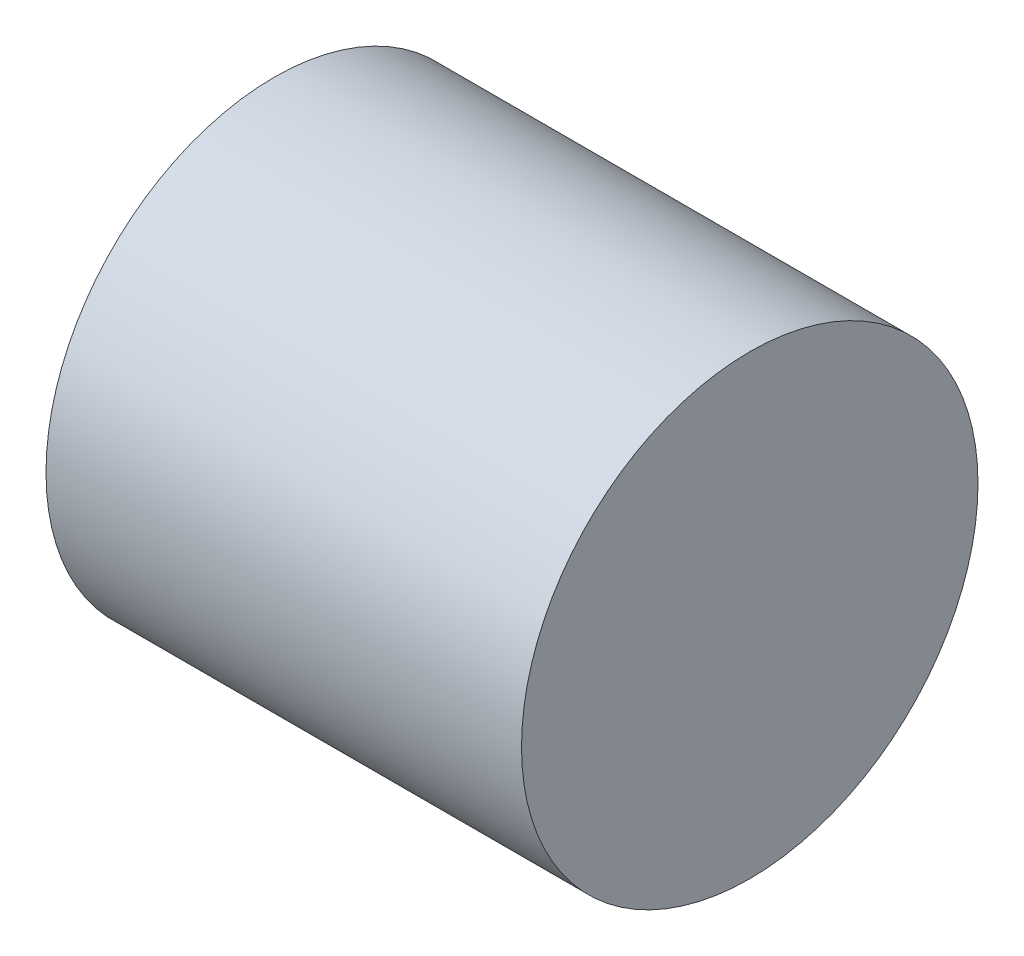
ISO-10303-21;
HEADER;
FILE_DESCRIPTION(('STEP AP214'),'2;1');
FILE_NAME('part.step','',(''),(''),'','','');
FILE_SCHEMA(('AUTOMOTIVE_DESIGN { 1 0 10303 214 1 1 1 1 }'));
ENDSEC;
DATA;
#1=APPLICATION_CONTEXT('core data for automotive mechanical design processes');
#2=APPLICATION_PROTOCOL_DEFINITION('international standard','automotive_design',2000,#1);
#3=PRODUCT_CONTEXT('',#1,'mechanical');
#4=PRODUCT('Part','Part','',(#3));
#5=PRODUCT_RELATED_PRODUCT_CATEGORY('part','',(#4));
#6=PRODUCT_DEFINITION_FORMATION('','',#4);
#7=PRODUCT_DEFINITION_CONTEXT('part definition',#1,'design');
#8=PRODUCT_DEFINITION('design','',#6,#7);
#9=PRODUCT_DEFINITION_SHAPE('','',#8);
#10=(LENGTH_UNIT() NAMED_UNIT(*) SI_UNIT(.MILLI.,.METRE.));
#11=(NAMED_UNIT(*) PLANE_ANGLE_UNIT() SI_UNIT($,.RADIAN.));
#12=(NAMED_UNIT(*) SI_UNIT($,.STERADIAN.) SOLID_ANGLE_UNIT());
#13=UNCERTAINTY_MEASURE_WITH_UNIT(LENGTH_MEASURE(1.E-05),#10,'distance_accuracy_value','');
#14=(GEOMETRIC_REPRESENTATION_CONTEXT(3) GLOBAL_UNCERTAINTY_ASSIGNED_CONTEXT((#13)) GLOBAL_UNIT_ASSIGNED_CONTEXT((#10,
#11,#12)) REPRESENTATION_CONTEXT('',''));
#15=CARTESIAN_POINT('',(0.,0.,0.));
#16=DIRECTION('',(0.,0.,1.));
#17=DIRECTION('',(1.,0.,0.));
#18=AXIS2_PLACEMENT_3D('',#15,#16,#17);
#19=CARTESIAN_POINT('',(0.,0.,0.));
#20=DIRECTION('',(1.,0.,0.));
#21=DIRECTION('',(0.,0.,-1.));
#22=AXIS2_PLACEMENT_3D('',#19,#20,#21);
#23=PLANE('',#22);
#24=CARTESIAN_POINT('',(0.,0.,0.));
#25=DIRECTION('',(-1.,0.,0.));
#26=DIRECTION('',(0.,0.,1.));
#27=AXIS2_PLACEMENT_3D('',#24,#25,#26);
#28=CIRCLE('',#27,12.);
#29=CARTESIAN_POINT('',(0.,12.,-8.61550327161987E-08));
#30=VERTEX_POINT('',#29);
#31=CARTESIAN_POINT('',(0.,12.,0.));
#32=VERTEX_POINT('',#31);
#33=EDGE_CURVE('E11',#30,#32,#28,.T.);
#34=ORIENTED_EDGE('',*,*,#33,.T.);
#35=DIRECTION('',(0.,-1.,0.));
#36=VECTOR('',#35,1.);
#37=CARTESIAN_POINT('',(0.,0.,0.));
#38=LINE('',#37,#36);
#39=CARTESIAN_POINT('',(0.,0.,0.));
#40=VERTEX_POINT('',#39);
#41=EDGE_CURVE('E55',#32,#40,#38,.T.);
#42=ORIENTED_EDGE('',*,*,#41,.T.);
#43=DIRECTION('',(0.,-1.,7.17958605968322E-09));
#44=VECTOR('',#43,1.);
#45=CARTESIAN_POINT('',(0.,0.,0.));
#46=LINE('',#45,#44);
#47=EDGE_CURVE('E76',#30,#40,#46,.T.);
#48=ORIENTED_EDGE('',*,*,#47,.F.);
#49=EDGE_LOOP('',(#34,#42,#48));
#50=FACE_BOUND('',#49,.T.);
#51=ADVANCED_FACE('F39',(#50),#23,.F.);
#52=CARTESIAN_POINT('',(0.,0.,0.));
#53=DIRECTION('',(-1.,0.,0.));
#54=DIRECTION('',(0.,0.,1.));
#55=AXIS2_PLACEMENT_3D('',#52,#53,#54);
#56=CYLINDRICAL_SURFACE('',#55,12.);
#57=CARTESIAN_POINT('',(25.,0.,0.));
#58=DIRECTION('',(-1.,0.,0.));
#59=DIRECTION('',(0.,0.,1.));
#60=AXIS2_PLACEMENT_3D('',#57,#58,#59);
#61=CIRCLE('',#60,12.);
#62=CARTESIAN_POINT('',(25.,12.,-8.61550327161987E-08));
#63=VERTEX_POINT('',#62);
#64=CARTESIAN_POINT('',(25.,12.,0.));
#65=VERTEX_POINT('',#64);
#66=EDGE_CURVE('E46',#63,#65,#61,.T.);
#67=ORIENTED_EDGE('',*,*,#66,.T.);
#68=DIRECTION('',(-1.,0.,0.));
#69=VECTOR('',#68,1.);
#70=CARTESIAN_POINT('',(0.,12.,0.));
#71=LINE('',#70,#69);
#72=EDGE_CURVE('E74',#65,#32,#71,.T.);
#73=ORIENTED_EDGE('',*,*,#72,.T.);
#74=ORIENTED_EDGE('',*,*,#33,.F.);
#75=DIRECTION('',(-1.,0.,0.));
#76=VECTOR('',#75,1.);
#77=CARTESIAN_POINT('',(0.,12.,-8.61550327161987E-08));
#78=LINE('',#77,#76);
#79=EDGE_CURVE('E73',#63,#30,#78,.T.);
#80=ORIENTED_EDGE('',*,*,#79,.F.);
#81=EDGE_LOOP('',(#67,#73,#74,#80));
#82=FACE_BOUND('',#81,.T.);
#83=ADVANCED_FACE('F71',(#82),#56,.T.);
#84=CARTESIAN_POINT('',(25.,12.,-8.61550327161987E-08));
#85=DIRECTION('',(-1.,0.,0.));
#86=DIRECTION('',(0.,0.,1.));
#87=AXIS2_PLACEMENT_3D('',#84,#85,#86);
#88=PLANE('',#87);
#89=DIRECTION('',(0.,1.,-7.17958605968322E-09));
#90=VECTOR('',#89,1.);
#91=CARTESIAN_POINT('',(25.,12.,-8.61550327161987E-08));
#92=LINE('',#91,#90);
#93=CARTESIAN_POINT('',(25.,0.,0.));
#94=VERTEX_POINT('',#93);
#95=EDGE_CURVE('E85',#94,#63,#92,.T.);
#96=ORIENTED_EDGE('',*,*,#95,.F.);
#97=DIRECTION('',(0.,1.,0.));
#98=VECTOR('',#97,1.);
#99=CARTESIAN_POINT('',(25.,12.,0.));
#100=LINE('',#99,#98);
#101=EDGE_CURVE('E79',#94,#65,#100,.T.);
#102=ORIENTED_EDGE('',*,*,#101,.T.);
#103=ORIENTED_EDGE('',*,*,#66,.F.);
#104=EDGE_LOOP('',(#96,#102,#103));
#105=FACE_BOUND('',#104,.T.);
#106=ADVANCED_FACE('F83',(#105),#88,.F.);
#107=CARTESIAN_POINT('',(0.,0.,0.));
#108=DIRECTION('',(0.,-7.17958605968322E-09,-1.));
#109=DIRECTION('',(-1.,0.,0.));
#110=AXIS2_PLACEMENT_3D('',#107,#108,#109);
#111=PLANE('',#110);
#112=DIRECTION('',(1.,0.,0.));
#113=VECTOR('',#112,1.);
#114=CARTESIAN_POINT('',(25.,0.,0.));
#115=LINE('',#114,#113);
#116=EDGE_CURVE('E88',#40,#94,#115,.T.);
#117=ORIENTED_EDGE('',*,*,#116,.T.);
#118=ORIENTED_EDGE('',*,*,#95,.T.);
#119=ORIENTED_EDGE('',*,*,#79,.T.);
#120=ORIENTED_EDGE('',*,*,#47,.T.);
#121=EDGE_LOOP('',(#117,#118,#119,#120));
#122=FACE_BOUND('',#121,.T.);
#123=ADVANCED_FACE('F94',(#122),#111,.F.);
#124=CARTESIAN_POINT('',(0.,0.,0.));
#125=DIRECTION('',(0.,0.,-1.));
#126=DIRECTION('',(-1.,0.,0.));
#127=AXIS2_PLACEMENT_3D('',#124,#125,#126);
#128=PLANE('',#127);
#129=ORIENTED_EDGE('',*,*,#116,.F.);
#130=ORIENTED_EDGE('',*,*,#41,.F.);
#131=ORIENTED_EDGE('',*,*,#72,.F.);
#132=ORIENTED_EDGE('',*,*,#101,.F.);
#133=EDGE_LOOP('',(#129,#130,#131,#132));
#134=FACE_BOUND('',#133,.T.);
#135=ADVANCED_FACE('F86',(#134),#128,.T.);
#136=CLOSED_SHELL('',(#51,#83,#106,#123,#135));
#137=MANIFOLD_SOLID_BREP('B2',#136);
#138=ADVANCED_BREP_SHAPE_REPRESENTATION('',(#18,#137),#14);
#139=SHAPE_DEFINITION_REPRESENTATION(#9,#138);
ENDSEC;
END-ISO-10303-21;
